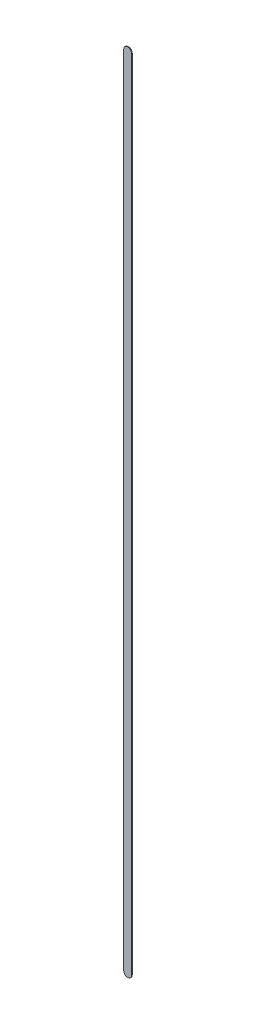
ISO-10303-21;
HEADER;
FILE_DESCRIPTION(('STEP AP214'),'2;1');
FILE_NAME('part.step','',(''),(''),'','','');
FILE_SCHEMA(('AUTOMOTIVE_DESIGN { 1 0 10303 214 1 1 1 1 }'));
ENDSEC;
DATA;
#1=APPLICATION_CONTEXT('core data for automotive mechanical design processes');
#2=APPLICATION_PROTOCOL_DEFINITION('international standard','automotive_design',2000,#1);
#3=PRODUCT_CONTEXT('',#1,'mechanical');
#4=PRODUCT('Part','Part','',(#3));
#5=PRODUCT_RELATED_PRODUCT_CATEGORY('part','',(#4));
#6=PRODUCT_DEFINITION_FORMATION('','',#4);
#7=PRODUCT_DEFINITION_CONTEXT('part definition',#1,'design');
#8=PRODUCT_DEFINITION('design','',#6,#7);
#9=PRODUCT_DEFINITION_SHAPE('','',#8);
#10=(LENGTH_UNIT() NAMED_UNIT(*) SI_UNIT(.MILLI.,.METRE.));
#11=(NAMED_UNIT(*) PLANE_ANGLE_UNIT() SI_UNIT($,.RADIAN.));
#12=(NAMED_UNIT(*) SI_UNIT($,.STERADIAN.) SOLID_ANGLE_UNIT());
#13=UNCERTAINTY_MEASURE_WITH_UNIT(LENGTH_MEASURE(1.E-05),#10,'distance_accuracy_value','');
#14=(GEOMETRIC_REPRESENTATION_CONTEXT(3) GLOBAL_UNCERTAINTY_ASSIGNED_CONTEXT((#13)) GLOBAL_UNIT_ASSIGNED_CONTEXT((#10,
#11,#12)) REPRESENTATION_CONTEXT('',''));
#15=CARTESIAN_POINT('',(0.,0.,0.));
#16=DIRECTION('',(0.,0.,1.));
#17=DIRECTION('',(1.,0.,0.));
#18=AXIS2_PLACEMENT_3D('',#15,#16,#17);
#19=CARTESIAN_POINT('',(41.6875,32.975,1.1723000001));
#20=DIRECTION('',(0.,0.,1.));
#21=DIRECTION('',(1.,0.,0.));
#22=AXIS2_PLACEMENT_3D('',#19,#20,#21);
#23=PLANE('',#22);
#24=CARTESIAN_POINT('',(41.6875,40.575,1.1723000001));
#25=DIRECTION('',(0.,0.,-1.));
#26=DIRECTION('',(1.,0.,0.));
#27=AXIS2_PLACEMENT_3D('',#24,#25,#26);
#28=CIRCLE('',#27,0.075);
#29=CARTESIAN_POINT('',(41.6125,40.575,1.1723000001));
#30=VERTEX_POINT('',#29);
#31=CARTESIAN_POINT('',(41.7625,40.575,1.1723000001));
#32=VERTEX_POINT('',#31);
#33=EDGE_CURVE('E119',#30,#32,#28,.T.);
#34=ORIENTED_EDGE('',*,*,#33,.F.);
#35=DIRECTION('',(0.,-1.,0.));
#36=VECTOR('',#35,1.);
#37=CARTESIAN_POINT('',(41.6125,25.375,1.1723000001));
#38=LINE('',#37,#36);
#39=CARTESIAN_POINT('',(41.6125,25.375,1.1723000001));
#40=VERTEX_POINT('',#39);
#41=EDGE_CURVE('E20',#30,#40,#38,.T.);
#42=ORIENTED_EDGE('',*,*,#41,.T.);
#43=CARTESIAN_POINT('',(41.6875,25.375,1.1723000001));
#44=DIRECTION('',(0.,0.,1.));
#45=DIRECTION('',(1.,0.,0.));
#46=AXIS2_PLACEMENT_3D('',#43,#44,#45);
#47=CIRCLE('',#46,0.075);
#48=CARTESIAN_POINT('',(41.7625,25.375,1.1723000001));
#49=VERTEX_POINT('',#48);
#50=EDGE_CURVE('E107',#40,#49,#47,.T.);
#51=ORIENTED_EDGE('',*,*,#50,.T.);
#52=DIRECTION('',(0.,1.,0.));
#53=VECTOR('',#52,1.);
#54=CARTESIAN_POINT('',(41.7625,40.575,1.1723000001));
#55=LINE('',#54,#53);
#56=EDGE_CURVE('E11',#49,#32,#55,.T.);
#57=ORIENTED_EDGE('',*,*,#56,.T.);
#58=EDGE_LOOP('',(#34,#42,#51,#57));
#59=FACE_BOUND('',#58,.T.);
#60=ADVANCED_FACE('F17',(#59),#23,.T.);
#61=CARTESIAN_POINT('',(41.7625,40.575,1.1596000001));
#62=DIRECTION('',(-1.,0.,0.));
#63=DIRECTION('',(0.,0.,1.));
#64=AXIS2_PLACEMENT_3D('',#61,#62,#63);
#65=PLANE('',#64);
#66=DIRECTION('',(0.,0.,1.));
#67=VECTOR('',#66,1.);
#68=CARTESIAN_POINT('',(41.7625,25.375,1.1596000001));
#69=LINE('',#68,#67);
#70=CARTESIAN_POINT('',(41.7625,25.375,1.1596000001));
#71=VERTEX_POINT('',#70);
#72=EDGE_CURVE('E110',#71,#49,#69,.T.);
#73=ORIENTED_EDGE('',*,*,#72,.F.);
#74=DIRECTION('',(0.,1.,0.));
#75=VECTOR('',#74,1.);
#76=CARTESIAN_POINT('',(41.7625,32.975,1.1596000001));
#77=LINE('',#76,#75);
#78=CARTESIAN_POINT('',(41.7625,40.575,1.1596000001));
#79=VERTEX_POINT('',#78);
#80=EDGE_CURVE('E91',#71,#79,#77,.T.);
#81=ORIENTED_EDGE('',*,*,#80,.T.);
#82=DIRECTION('',(0.,0.,-1.));
#83=VECTOR('',#82,1.);
#84=CARTESIAN_POINT('',(41.7625,40.575,1.1596000001));
#85=LINE('',#84,#83);
#86=EDGE_CURVE('E27',#32,#79,#85,.T.);
#87=ORIENTED_EDGE('',*,*,#86,.F.);
#88=ORIENTED_EDGE('',*,*,#56,.F.);
#89=EDGE_LOOP('',(#73,#81,#87,#88));
#90=FACE_BOUND('',#89,.T.);
#91=ADVANCED_FACE('F118',(#90),#65,.F.);
#92=CARTESIAN_POINT('',(41.6875,40.575,1.1596000001));
#93=DIRECTION('',(0.,0.,1.));
#94=DIRECTION('',(1.,0.,0.));
#95=AXIS2_PLACEMENT_3D('',#92,#93,#94);
#96=CYLINDRICAL_SURFACE('',#95,0.075);
#97=CARTESIAN_POINT('',(41.6875,40.575,1.1596000001));
#98=DIRECTION('',(0.,0.,1.));
#99=DIRECTION('',(1.,0.,0.));
#100=AXIS2_PLACEMENT_3D('',#97,#98,#99);
#101=CIRCLE('',#100,0.075);
#102=CARTESIAN_POINT('',(41.6125,40.575,1.1596000001));
#103=VERTEX_POINT('',#102);
#104=EDGE_CURVE('E85',#79,#103,#101,.T.);
#105=ORIENTED_EDGE('',*,*,#104,.T.);
#106=DIRECTION('',(0.,0.,1.));
#107=VECTOR('',#106,1.);
#108=CARTESIAN_POINT('',(41.6125,40.575,1.1596000001));
#109=LINE('',#108,#107);
#110=EDGE_CURVE('E75',#103,#30,#109,.T.);
#111=ORIENTED_EDGE('',*,*,#110,.T.);
#112=ORIENTED_EDGE('',*,*,#33,.T.);
#113=ORIENTED_EDGE('',*,*,#86,.T.);
#114=EDGE_LOOP('',(#105,#111,#112,#113));
#115=FACE_BOUND('',#114,.T.);
#116=ADVANCED_FACE('F86',(#115),#96,.T.);
#117=CARTESIAN_POINT('',(41.6125,25.375,1.1596000001));
#118=DIRECTION('',(1.,0.,0.));
#119=DIRECTION('',(0.,1.,0.));
#120=AXIS2_PLACEMENT_3D('',#117,#118,#119);
#121=PLANE('',#120);
#122=ORIENTED_EDGE('',*,*,#110,.F.);
#123=DIRECTION('',(0.,-1.,0.));
#124=VECTOR('',#123,1.);
#125=CARTESIAN_POINT('',(41.6125,32.975,1.1596000001));
#126=LINE('',#125,#124);
#127=CARTESIAN_POINT('',(41.6125,25.375,1.1596000001));
#128=VERTEX_POINT('',#127);
#129=EDGE_CURVE('E79',#103,#128,#126,.T.);
#130=ORIENTED_EDGE('',*,*,#129,.T.);
#131=DIRECTION('',(0.,0.,-1.));
#132=VECTOR('',#131,1.);
#133=CARTESIAN_POINT('',(41.6125,25.375,1.1596000001));
#134=LINE('',#133,#132);
#135=EDGE_CURVE('E66',#40,#128,#134,.T.);
#136=ORIENTED_EDGE('',*,*,#135,.F.);
#137=ORIENTED_EDGE('',*,*,#41,.F.);
#138=EDGE_LOOP('',(#122,#130,#136,#137));
#139=FACE_BOUND('',#138,.T.);
#140=ADVANCED_FACE('F77',(#139),#121,.F.);
#141=CARTESIAN_POINT('',(41.6875,25.375,1.1596000001));
#142=DIRECTION('',(0.,0.,1.));
#143=DIRECTION('',(1.,0.,0.));
#144=AXIS2_PLACEMENT_3D('',#141,#142,#143);
#145=CYLINDRICAL_SURFACE('',#144,0.075);
#146=CARTESIAN_POINT('',(41.6875,25.375,1.1596000001));
#147=DIRECTION('',(0.,0.,1.));
#148=DIRECTION('',(1.,0.,0.));
#149=AXIS2_PLACEMENT_3D('',#146,#147,#148);
#150=CIRCLE('',#149,0.075);
#151=EDGE_CURVE('E94',#128,#71,#150,.T.);
#152=ORIENTED_EDGE('',*,*,#151,.T.);
#153=ORIENTED_EDGE('',*,*,#72,.T.);
#154=ORIENTED_EDGE('',*,*,#50,.F.);
#155=ORIENTED_EDGE('',*,*,#135,.T.);
#156=EDGE_LOOP('',(#152,#153,#154,#155));
#157=FACE_BOUND('',#156,.T.);
#158=ADVANCED_FACE('F116',(#157),#145,.T.);
#159=CARTESIAN_POINT('',(41.6875,32.975,1.1596000001));
#160=DIRECTION('',(0.,0.,1.));
#161=DIRECTION('',(1.,0.,0.));
#162=AXIS2_PLACEMENT_3D('',#159,#160,#161);
#163=PLANE('',#162);
#164=ORIENTED_EDGE('',*,*,#129,.F.);
#165=ORIENTED_EDGE('',*,*,#104,.F.);
#166=ORIENTED_EDGE('',*,*,#80,.F.);
#167=ORIENTED_EDGE('',*,*,#151,.F.);
#168=EDGE_LOOP('',(#164,#165,#166,#167));
#169=FACE_BOUND('',#168,.T.);
#170=ADVANCED_FACE('F93',(#169),#163,.F.);
#171=CLOSED_SHELL('',(#60,#91,#116,#140,#158,#170));
#172=MANIFOLD_SOLID_BREP('B1',#171);
#173=ADVANCED_BREP_SHAPE_REPRESENTATION('',(#18,#172),#14);
#174=SHAPE_DEFINITION_REPRESENTATION(#9,#173);
ENDSEC;
END-ISO-10303-21;
